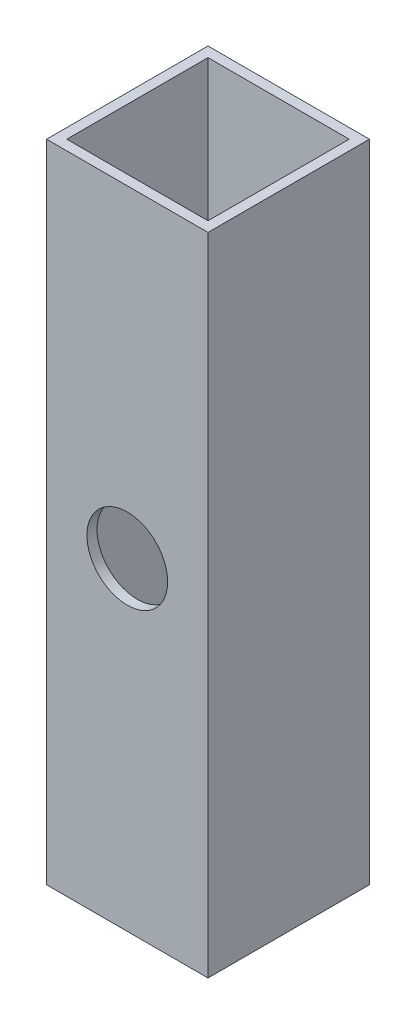
ISO-10303-21;
HEADER;
FILE_DESCRIPTION(('STEP AP214'),'2;1');
FILE_NAME('part.step','',(''),(''),'','','');
FILE_SCHEMA(('AUTOMOTIVE_DESIGN { 1 0 10303 214 1 1 1 1 }'));
ENDSEC;
DATA;
#1=APPLICATION_CONTEXT('core data for automotive mechanical design processes');
#2=APPLICATION_PROTOCOL_DEFINITION('international standard','automotive_design',2000,#1);
#3=PRODUCT_CONTEXT('',#1,'mechanical');
#4=PRODUCT('Part','Part','',(#3));
#5=PRODUCT_RELATED_PRODUCT_CATEGORY('part','',(#4));
#6=PRODUCT_DEFINITION_FORMATION('','',#4);
#7=PRODUCT_DEFINITION_CONTEXT('part definition',#1,'design');
#8=PRODUCT_DEFINITION('design','',#6,#7);
#9=PRODUCT_DEFINITION_SHAPE('','',#8);
#10=(LENGTH_UNIT() NAMED_UNIT(*) SI_UNIT(.MILLI.,.METRE.));
#11=(NAMED_UNIT(*) PLANE_ANGLE_UNIT() SI_UNIT($,.RADIAN.));
#12=(NAMED_UNIT(*) SI_UNIT($,.STERADIAN.) SOLID_ANGLE_UNIT());
#13=UNCERTAINTY_MEASURE_WITH_UNIT(LENGTH_MEASURE(1.E-05),#10,'distance_accuracy_value','');
#14=(GEOMETRIC_REPRESENTATION_CONTEXT(3) GLOBAL_UNCERTAINTY_ASSIGNED_CONTEXT((#13)) GLOBAL_UNIT_ASSIGNED_CONTEXT((#10,
#11,#12)) REPRESENTATION_CONTEXT('',''));
#15=CARTESIAN_POINT('',(0.,0.,0.));
#16=DIRECTION('',(0.,0.,1.));
#17=DIRECTION('',(1.,0.,0.));
#18=AXIS2_PLACEMENT_3D('',#15,#16,#17);
#19=CARTESIAN_POINT('',(0.,101.6,0.));
#20=DIRECTION('',(0.,-1.,0.));
#21=DIRECTION('',(0.,0.,-1.));
#22=AXIS2_PLACEMENT_3D('',#19,#20,#21);
#23=PLANE('',#22);
#24=DIRECTION('',(0.,0.,1.));
#25=VECTOR('',#24,1.);
#26=CARTESIAN_POINT('',(-12.7,101.6,-12.7));
#27=LINE('',#26,#25);
#28=CARTESIAN_POINT('',(-12.7,101.6,-12.7));
#29=VERTEX_POINT('',#28);
#30=CARTESIAN_POINT('',(-12.7,101.6,12.7));
#31=VERTEX_POINT('',#30);
#32=EDGE_CURVE('E137',#29,#31,#27,.T.);
#33=ORIENTED_EDGE('',*,*,#32,.T.);
#34=DIRECTION('',(1.,0.,0.));
#35=VECTOR('',#34,1.);
#36=CARTESIAN_POINT('',(12.7,101.6,12.7));
#37=LINE('',#36,#35);
#38=CARTESIAN_POINT('',(12.7,101.6,12.7));
#39=VERTEX_POINT('',#38);
#40=EDGE_CURVE('E140',#31,#39,#37,.T.);
#41=ORIENTED_EDGE('',*,*,#40,.T.);
#42=DIRECTION('',(0.,0.,-1.));
#43=VECTOR('',#42,1.);
#44=CARTESIAN_POINT('',(12.7,101.6,-12.7));
#45=LINE('',#44,#43);
#46=CARTESIAN_POINT('',(12.7,101.6,-12.7));
#47=VERTEX_POINT('',#46);
#48=EDGE_CURVE('E143',#39,#47,#45,.T.);
#49=ORIENTED_EDGE('',*,*,#48,.T.);
#50=DIRECTION('',(-1.,0.,0.));
#51=VECTOR('',#50,1.);
#52=CARTESIAN_POINT('',(12.7,101.6,-12.7));
#53=LINE('',#52,#51);
#54=EDGE_CURVE('E145',#47,#29,#53,.T.);
#55=ORIENTED_EDGE('',*,*,#54,.T.);
#56=EDGE_LOOP('',(#33,#41,#49,#55));
#57=FACE_BOUND('',#56,.T.);
#58=DIRECTION('',(0.,0.,1.));
#59=VECTOR('',#58,1.);
#60=CARTESIAN_POINT('',(-11.1125,101.6,-11.1125));
#61=LINE('',#60,#59);
#62=CARTESIAN_POINT('',(-11.1125,101.6,-11.1125));
#63=VERTEX_POINT('',#62);
#64=CARTESIAN_POINT('',(-11.1125,101.6,11.1125));
#65=VERTEX_POINT('',#64);
#66=EDGE_CURVE('E99',#63,#65,#61,.T.);
#67=ORIENTED_EDGE('',*,*,#66,.F.);
#68=DIRECTION('',(-1.,0.,0.));
#69=VECTOR('',#68,1.);
#70=CARTESIAN_POINT('',(11.1125,101.6,-11.1125));
#71=LINE('',#70,#69);
#72=CARTESIAN_POINT('',(11.1125,101.6,-11.1125));
#73=VERTEX_POINT('',#72);
#74=EDGE_CURVE('E121',#73,#63,#71,.T.);
#75=ORIENTED_EDGE('',*,*,#74,.F.);
#76=DIRECTION('',(0.,0.,-1.));
#77=VECTOR('',#76,1.);
#78=CARTESIAN_POINT('',(11.1125,101.6,-11.1125));
#79=LINE('',#78,#77);
#80=CARTESIAN_POINT('',(11.1125,101.6,11.1125));
#81=VERTEX_POINT('',#80);
#82=EDGE_CURVE('E119',#81,#73,#79,.T.);
#83=ORIENTED_EDGE('',*,*,#82,.F.);
#84=DIRECTION('',(1.,0.,0.));
#85=VECTOR('',#84,1.);
#86=CARTESIAN_POINT('',(11.1125,101.6,11.1125));
#87=LINE('',#86,#85);
#88=EDGE_CURVE('E107',#65,#81,#87,.T.);
#89=ORIENTED_EDGE('',*,*,#88,.F.);
#90=EDGE_LOOP('',(#67,#75,#83,#89));
#91=FACE_BOUND('',#90,.T.);
#92=ADVANCED_FACE('F33',(#57,#91),#23,.F.);
#93=CARTESIAN_POINT('',(0.,0.,0.));
#94=DIRECTION('',(0.,-1.,0.));
#95=DIRECTION('',(0.,0.,-1.));
#96=AXIS2_PLACEMENT_3D('',#93,#94,#95);
#97=PLANE('',#96);
#98=DIRECTION('',(0.,0.,1.));
#99=VECTOR('',#98,1.);
#100=CARTESIAN_POINT('',(-12.7,0.,-12.7));
#101=LINE('',#100,#99);
#102=CARTESIAN_POINT('',(-12.7,0.,-12.7));
#103=VERTEX_POINT('',#102);
#104=CARTESIAN_POINT('',(-12.7,0.,12.7));
#105=VERTEX_POINT('',#104);
#106=EDGE_CURVE('E115',#103,#105,#101,.T.);
#107=ORIENTED_EDGE('',*,*,#106,.F.);
#108=DIRECTION('',(-1.,0.,0.));
#109=VECTOR('',#108,1.);
#110=CARTESIAN_POINT('',(12.7,0.,-12.7));
#111=LINE('',#110,#109);
#112=CARTESIAN_POINT('',(12.7,0.,-12.7));
#113=VERTEX_POINT('',#112);
#114=EDGE_CURVE('E141',#113,#103,#111,.T.);
#115=ORIENTED_EDGE('',*,*,#114,.F.);
#116=DIRECTION('',(0.,0.,-1.));
#117=VECTOR('',#116,1.);
#118=CARTESIAN_POINT('',(12.7,0.,-12.7));
#119=LINE('',#118,#117);
#120=CARTESIAN_POINT('',(12.7,0.,12.7));
#121=VERTEX_POINT('',#120);
#122=EDGE_CURVE('E152',#121,#113,#119,.T.);
#123=ORIENTED_EDGE('',*,*,#122,.F.);
#124=DIRECTION('',(1.,0.,0.));
#125=VECTOR('',#124,1.);
#126=CARTESIAN_POINT('',(12.7,0.,12.7));
#127=LINE('',#126,#125);
#128=EDGE_CURVE('E150',#105,#121,#127,.T.);
#129=ORIENTED_EDGE('',*,*,#128,.F.);
#130=EDGE_LOOP('',(#107,#115,#123,#129));
#131=FACE_BOUND('',#130,.T.);
#132=DIRECTION('',(-1.,0.,0.));
#133=VECTOR('',#132,1.);
#134=CARTESIAN_POINT('',(11.1125,0.,-11.1125));
#135=LINE('',#134,#133);
#136=CARTESIAN_POINT('',(11.1125,0.,-11.1125));
#137=VERTEX_POINT('',#136);
#138=CARTESIAN_POINT('',(-11.1125,0.,-11.1125));
#139=VERTEX_POINT('',#138);
#140=EDGE_CURVE('E108',#137,#139,#135,.T.);
#141=ORIENTED_EDGE('',*,*,#140,.T.);
#142=DIRECTION('',(0.,0.,1.));
#143=VECTOR('',#142,1.);
#144=CARTESIAN_POINT('',(-11.1125,0.,-11.1125));
#145=LINE('',#144,#143);
#146=CARTESIAN_POINT('',(-11.1125,0.,11.1125));
#147=VERTEX_POINT('',#146);
#148=EDGE_CURVE('E57',#139,#147,#145,.T.);
#149=ORIENTED_EDGE('',*,*,#148,.T.);
#150=DIRECTION('',(1.,0.,0.));
#151=VECTOR('',#150,1.);
#152=CARTESIAN_POINT('',(11.1125,0.,11.1125));
#153=LINE('',#152,#151);
#154=CARTESIAN_POINT('',(11.1125,0.,11.1125));
#155=VERTEX_POINT('',#154);
#156=EDGE_CURVE('E114',#147,#155,#153,.T.);
#157=ORIENTED_EDGE('',*,*,#156,.T.);
#158=DIRECTION('',(0.,0.,-1.));
#159=VECTOR('',#158,1.);
#160=CARTESIAN_POINT('',(11.1125,0.,-11.1125));
#161=LINE('',#160,#159);
#162=EDGE_CURVE('E129',#155,#137,#161,.T.);
#163=ORIENTED_EDGE('',*,*,#162,.T.);
#164=EDGE_LOOP('',(#141,#149,#157,#163));
#165=FACE_BOUND('',#164,.T.);
#166=ADVANCED_FACE('F171',(#131,#165),#97,.T.);
#167=CARTESIAN_POINT('',(-12.7,101.6,-12.7));
#168=DIRECTION('',(1.,0.,0.));
#169=DIRECTION('',(0.,0.,-1.));
#170=AXIS2_PLACEMENT_3D('',#167,#168,#169);
#171=PLANE('',#170);
#172=ORIENTED_EDGE('',*,*,#106,.T.);
#173=DIRECTION('',(0.,-1.,0.));
#174=VECTOR('',#173,1.);
#175=CARTESIAN_POINT('',(-12.7,101.6,12.7));
#176=LINE('',#175,#174);
#177=EDGE_CURVE('E11',#31,#105,#176,.T.);
#178=ORIENTED_EDGE('',*,*,#177,.F.);
#179=ORIENTED_EDGE('',*,*,#32,.F.);
#180=DIRECTION('',(0.,-1.,0.));
#181=VECTOR('',#180,1.);
#182=CARTESIAN_POINT('',(-12.7,101.6,-12.7));
#183=LINE('',#182,#181);
#184=EDGE_CURVE('E147',#29,#103,#183,.T.);
#185=ORIENTED_EDGE('',*,*,#184,.T.);
#186=EDGE_LOOP('',(#172,#178,#179,#185));
#187=FACE_BOUND('',#186,.T.);
#188=ADVANCED_FACE('F35',(#187),#171,.F.);
#189=CARTESIAN_POINT('',(12.7,101.6,12.7));
#190=DIRECTION('',(0.,0.,-1.));
#191=DIRECTION('',(-1.,0.,0.));
#192=AXIS2_PLACEMENT_3D('',#189,#190,#191);
#193=PLANE('',#192);
#194=CARTESIAN_POINT('',(0.,50.8,12.7));
#195=DIRECTION('',(0.,0.,1.));
#196=DIRECTION('',(1.,0.,0.));
#197=AXIS2_PLACEMENT_3D('',#194,#195,#196);
#198=CIRCLE('',#197,6.35);
#199=CARTESIAN_POINT('',(6.35,50.8,12.7));
#200=VERTEX_POINT('',#199);
#201=EDGE_CURVE('E211',#200,#200,#198,.T.);
#202=ORIENTED_EDGE('',*,*,#201,.F.);
#203=EDGE_LOOP('',(#202));
#204=FACE_BOUND('',#203,.T.);
#205=ORIENTED_EDGE('',*,*,#128,.T.);
#206=DIRECTION('',(0.,-1.,0.));
#207=VECTOR('',#206,1.);
#208=CARTESIAN_POINT('',(12.7,101.6,12.7));
#209=LINE('',#208,#207);
#210=EDGE_CURVE('E42',#39,#121,#209,.T.);
#211=ORIENTED_EDGE('',*,*,#210,.F.);
#212=ORIENTED_EDGE('',*,*,#40,.F.);
#213=ORIENTED_EDGE('',*,*,#177,.T.);
#214=EDGE_LOOP('',(#205,#211,#212,#213));
#215=FACE_BOUND('',#214,.T.);
#216=ADVANCED_FACE('F181',(#204,#215),#193,.F.);
#217=CARTESIAN_POINT('',(12.7,101.6,-12.7));
#218=DIRECTION('',(-1.,0.,0.));
#219=DIRECTION('',(0.,0.,1.));
#220=AXIS2_PLACEMENT_3D('',#217,#218,#219);
#221=PLANE('',#220);
#222=ORIENTED_EDGE('',*,*,#122,.T.);
#223=DIRECTION('',(0.,-1.,0.));
#224=VECTOR('',#223,1.);
#225=CARTESIAN_POINT('',(12.7,101.6,-12.7));
#226=LINE('',#225,#224);
#227=EDGE_CURVE('E157',#47,#113,#226,.T.);
#228=ORIENTED_EDGE('',*,*,#227,.F.);
#229=ORIENTED_EDGE('',*,*,#48,.F.);
#230=ORIENTED_EDGE('',*,*,#210,.T.);
#231=EDGE_LOOP('',(#222,#228,#229,#230));
#232=FACE_BOUND('',#231,.T.);
#233=ADVANCED_FACE('F165',(#232),#221,.F.);
#234=CARTESIAN_POINT('',(12.7,101.6,-12.7));
#235=DIRECTION('',(0.,0.,1.));
#236=DIRECTION('',(1.,0.,0.));
#237=AXIS2_PLACEMENT_3D('',#234,#235,#236);
#238=PLANE('',#237);
#239=CARTESIAN_POINT('',(0.,50.8,-12.7));
#240=DIRECTION('',(0.,0.,1.));
#241=DIRECTION('',(1.,0.,0.));
#242=AXIS2_PLACEMENT_3D('',#239,#240,#241);
#243=CIRCLE('',#242,6.35);
#244=CARTESIAN_POINT('',(6.35,50.8,-12.7));
#245=VERTEX_POINT('',#244);
#246=EDGE_CURVE('E127',#245,#245,#243,.T.);
#247=ORIENTED_EDGE('',*,*,#246,.T.);
#248=EDGE_LOOP('',(#247));
#249=FACE_BOUND('',#248,.T.);
#250=ORIENTED_EDGE('',*,*,#114,.T.);
#251=ORIENTED_EDGE('',*,*,#184,.F.);
#252=ORIENTED_EDGE('',*,*,#54,.F.);
#253=ORIENTED_EDGE('',*,*,#227,.T.);
#254=EDGE_LOOP('',(#250,#251,#252,#253));
#255=FACE_BOUND('',#254,.T.);
#256=ADVANCED_FACE('F175',(#249,#255),#238,.F.);
#257=CARTESIAN_POINT('',(-11.1125,101.6,-11.1125));
#258=DIRECTION('',(1.,0.,0.));
#259=DIRECTION('',(0.,0.,-1.));
#260=AXIS2_PLACEMENT_3D('',#257,#258,#259);
#261=PLANE('',#260);
#262=ORIENTED_EDGE('',*,*,#148,.F.);
#263=DIRECTION('',(0.,-1.,0.));
#264=VECTOR('',#263,1.);
#265=CARTESIAN_POINT('',(-11.1125,101.6,-11.1125));
#266=LINE('',#265,#264);
#267=EDGE_CURVE('E103',#63,#139,#266,.T.);
#268=ORIENTED_EDGE('',*,*,#267,.F.);
#269=ORIENTED_EDGE('',*,*,#66,.T.);
#270=DIRECTION('',(0.,-1.,0.));
#271=VECTOR('',#270,1.);
#272=CARTESIAN_POINT('',(-11.1125,101.6,11.1125));
#273=LINE('',#272,#271);
#274=EDGE_CURVE('E102',#65,#147,#273,.T.);
#275=ORIENTED_EDGE('',*,*,#274,.T.);
#276=EDGE_LOOP('',(#262,#268,#269,#275));
#277=FACE_BOUND('',#276,.T.);
#278=ADVANCED_FACE('F101',(#277),#261,.T.);
#279=CARTESIAN_POINT('',(11.1125,101.6,11.1125));
#280=DIRECTION('',(0.,0.,-1.));
#281=DIRECTION('',(-1.,0.,0.));
#282=AXIS2_PLACEMENT_3D('',#279,#280,#281);
#283=PLANE('',#282);
#284=CARTESIAN_POINT('',(0.,50.8,11.1125));
#285=DIRECTION('',(0.,0.,-1.));
#286=DIRECTION('',(-1.,0.,0.));
#287=AXIS2_PLACEMENT_3D('',#284,#285,#286);
#288=CIRCLE('',#287,6.35);
#289=CARTESIAN_POINT('',(-6.35,50.8,11.1125));
#290=VERTEX_POINT('',#289);
#291=EDGE_CURVE('E207',#290,#290,#288,.T.);
#292=ORIENTED_EDGE('',*,*,#291,.F.);
#293=EDGE_LOOP('',(#292));
#294=FACE_BOUND('',#293,.T.);
#295=ORIENTED_EDGE('',*,*,#156,.F.);
#296=ORIENTED_EDGE('',*,*,#274,.F.);
#297=ORIENTED_EDGE('',*,*,#88,.T.);
#298=DIRECTION('',(0.,-1.,0.));
#299=VECTOR('',#298,1.);
#300=CARTESIAN_POINT('',(11.1125,101.6,11.1125));
#301=LINE('',#300,#299);
#302=EDGE_CURVE('E116',#81,#155,#301,.T.);
#303=ORIENTED_EDGE('',*,*,#302,.T.);
#304=EDGE_LOOP('',(#295,#296,#297,#303));
#305=FACE_BOUND('',#304,.T.);
#306=ADVANCED_FACE('F111',(#294,#305),#283,.T.);
#307=CARTESIAN_POINT('',(11.1125,101.6,-11.1125));
#308=DIRECTION('',(-1.,0.,0.));
#309=DIRECTION('',(0.,0.,1.));
#310=AXIS2_PLACEMENT_3D('',#307,#308,#309);
#311=PLANE('',#310);
#312=ORIENTED_EDGE('',*,*,#162,.F.);
#313=ORIENTED_EDGE('',*,*,#302,.F.);
#314=ORIENTED_EDGE('',*,*,#82,.T.);
#315=DIRECTION('',(0.,-1.,0.));
#316=VECTOR('',#315,1.);
#317=CARTESIAN_POINT('',(11.1125,101.6,-11.1125));
#318=LINE('',#317,#316);
#319=EDGE_CURVE('E49',#73,#137,#318,.T.);
#320=ORIENTED_EDGE('',*,*,#319,.T.);
#321=EDGE_LOOP('',(#312,#313,#314,#320));
#322=FACE_BOUND('',#321,.T.);
#323=ADVANCED_FACE('F221',(#322),#311,.T.);
#324=CARTESIAN_POINT('',(11.1125,101.6,-11.1125));
#325=DIRECTION('',(0.,0.,1.));
#326=DIRECTION('',(1.,0.,0.));
#327=AXIS2_PLACEMENT_3D('',#324,#325,#326);
#328=PLANE('',#327);
#329=CARTESIAN_POINT('',(0.,50.8,-11.1125));
#330=DIRECTION('',(0.,0.,1.));
#331=DIRECTION('',(1.,0.,0.));
#332=AXIS2_PLACEMENT_3D('',#329,#330,#331);
#333=CIRCLE('',#332,6.35);
#334=CARTESIAN_POINT('',(6.35,50.8,-11.1125));
#335=VERTEX_POINT('',#334);
#336=EDGE_CURVE('E37',#335,#335,#333,.T.);
#337=ORIENTED_EDGE('',*,*,#336,.F.);
#338=EDGE_LOOP('',(#337));
#339=FACE_BOUND('',#338,.T.);
#340=ORIENTED_EDGE('',*,*,#140,.F.);
#341=ORIENTED_EDGE('',*,*,#319,.F.);
#342=ORIENTED_EDGE('',*,*,#74,.T.);
#343=ORIENTED_EDGE('',*,*,#267,.T.);
#344=EDGE_LOOP('',(#340,#341,#342,#343));
#345=FACE_BOUND('',#344,.T.);
#346=ADVANCED_FACE('F219',(#339,#345),#328,.T.);
#347=CARTESIAN_POINT('',(0.,50.8,-88.9));
#348=DIRECTION('',(0.,0.,1.));
#349=DIRECTION('',(1.,0.,0.));
#350=AXIS2_PLACEMENT_3D('',#347,#348,#349);
#351=CYLINDRICAL_SURFACE('',#350,6.35);
#352=ORIENTED_EDGE('',*,*,#336,.T.);
#353=EDGE_LOOP('',(#352));
#354=FACE_BOUND('',#353,.T.);
#355=ORIENTED_EDGE('',*,*,#246,.F.);
#356=EDGE_LOOP('',(#355));
#357=FACE_BOUND('',#356,.T.);
#358=ADVANCED_FACE('F217',(#354,#357),#351,.F.);
#359=ORIENTED_EDGE('',*,*,#291,.T.);
#360=EDGE_LOOP('',(#359));
#361=FACE_BOUND('',#360,.T.);
#362=ORIENTED_EDGE('',*,*,#201,.T.);
#363=EDGE_LOOP('',(#362));
#364=FACE_BOUND('',#363,.T.);
#365=ADVANCED_FACE('F233',(#361,#364),#351,.F.);
#366=CLOSED_SHELL('',(#92,#166,#188,#216,#233,#256,#278,#306,#323,#346,#358,#365));
#367=MANIFOLD_SOLID_BREP('B2',#366);
#368=ADVANCED_BREP_SHAPE_REPRESENTATION('',(#18,#367),#14);
#369=SHAPE_DEFINITION_REPRESENTATION(#9,#368);
ENDSEC;
END-ISO-10303-21;
